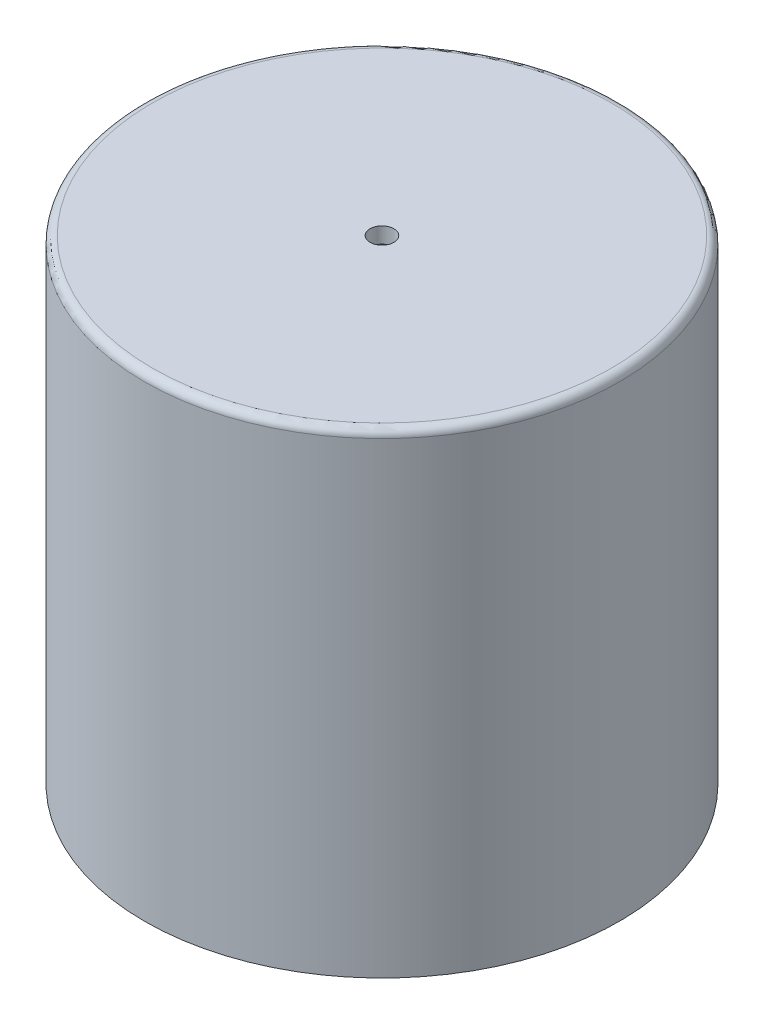
ISO-10303-21;
HEADER;
FILE_DESCRIPTION(('STEP AP214'),'2;1');
FILE_NAME('part.step','',(''),(''),'','','');
FILE_SCHEMA(('AUTOMOTIVE_DESIGN { 1 0 10303 214 1 1 1 1 }'));
ENDSEC;
DATA;
#1=APPLICATION_CONTEXT('core data for automotive mechanical design processes');
#2=APPLICATION_PROTOCOL_DEFINITION('international standard','automotive_design',2000,#1);
#3=PRODUCT_CONTEXT('',#1,'mechanical');
#4=PRODUCT('Part','Part','',(#3));
#5=PRODUCT_RELATED_PRODUCT_CATEGORY('part','',(#4));
#6=PRODUCT_DEFINITION_FORMATION('','',#4);
#7=PRODUCT_DEFINITION_CONTEXT('part definition',#1,'design');
#8=PRODUCT_DEFINITION('design','',#6,#7);
#9=PRODUCT_DEFINITION_SHAPE('','',#8);
#10=(LENGTH_UNIT() NAMED_UNIT(*) SI_UNIT(.MILLI.,.METRE.));
#11=(NAMED_UNIT(*) PLANE_ANGLE_UNIT() SI_UNIT($,.RADIAN.));
#12=(NAMED_UNIT(*) SI_UNIT($,.STERADIAN.) SOLID_ANGLE_UNIT());
#13=UNCERTAINTY_MEASURE_WITH_UNIT(LENGTH_MEASURE(1.E-05),#10,'distance_accuracy_value','');
#14=(GEOMETRIC_REPRESENTATION_CONTEXT(3) GLOBAL_UNCERTAINTY_ASSIGNED_CONTEXT((#13)) GLOBAL_UNIT_ASSIGNED_CONTEXT((#10,
#11,#12)) REPRESENTATION_CONTEXT('',''));
#15=CARTESIAN_POINT('',(0.,0.,0.));
#16=DIRECTION('',(0.,0.,1.));
#17=DIRECTION('',(1.,0.,0.));
#18=AXIS2_PLACEMENT_3D('',#15,#16,#17);
#19=CARTESIAN_POINT('',(0.,60.,0.));
#20=DIRECTION('',(0.,-1.,0.));
#21=DIRECTION('',(0.,0.,-1.));
#22=AXIS2_PLACEMENT_3D('',#19,#20,#21);
#23=CYLINDRICAL_SURFACE('',#22,30.);
#24=CARTESIAN_POINT('',(0.,59.,0.));
#25=DIRECTION('',(0.,1.,0.));
#26=DIRECTION('',(0.,0.,1.));
#27=AXIS2_PLACEMENT_3D('',#24,#25,#26);
#28=CIRCLE('',#27,30.);
#29=CARTESIAN_POINT('',(0.,59.,30.));
#30=VERTEX_POINT('',#29);
#31=EDGE_CURVE('E10',#30,#30,#28,.F.);
#32=ORIENTED_EDGE('',*,*,#31,.T.);
#33=EDGE_LOOP('',(#32));
#34=FACE_BOUND('',#33,.T.);
#35=CARTESIAN_POINT('',(0.,0.,0.));
#36=DIRECTION('',(0.,1.,0.));
#37=DIRECTION('',(0.,0.,1.));
#38=AXIS2_PLACEMENT_3D('',#35,#36,#37);
#39=CIRCLE('',#38,30.);
#40=CARTESIAN_POINT('',(0.,0.,30.));
#41=VERTEX_POINT('',#40);
#42=EDGE_CURVE('E53',#41,#41,#39,.T.);
#43=ORIENTED_EDGE('',*,*,#42,.T.);
#44=EDGE_LOOP('',(#43));
#45=FACE_BOUND('',#44,.T.);
#46=ADVANCED_FACE('F33',(#34,#45),#23,.T.);
#47=CARTESIAN_POINT('',(0.,60.,0.));
#48=DIRECTION('',(0.,1.,0.));
#49=DIRECTION('',(0.,0.,1.));
#50=AXIS2_PLACEMENT_3D('',#47,#48,#49);
#51=PLANE('',#50);
#52=CARTESIAN_POINT('',(0.,60.,0.));
#53=DIRECTION('',(0.,1.,0.));
#54=DIRECTION('',(0.,0.,1.));
#55=AXIS2_PLACEMENT_3D('',#52,#53,#54);
#56=CIRCLE('',#55,29.);
#57=CARTESIAN_POINT('',(0.,60.,29.));
#58=VERTEX_POINT('',#57);
#59=EDGE_CURVE('E40',#58,#58,#56,.T.);
#60=ORIENTED_EDGE('',*,*,#59,.T.);
#61=EDGE_LOOP('',(#60));
#62=FACE_BOUND('',#61,.T.);
#63=CARTESIAN_POINT('',(0.,60.,0.));
#64=DIRECTION('',(0.,1.,0.));
#65=DIRECTION('',(0.,0.,1.));
#66=AXIS2_PLACEMENT_3D('',#63,#64,#65);
#67=CIRCLE('',#66,1.5);
#68=CARTESIAN_POINT('',(0.,60.,1.5));
#69=VERTEX_POINT('',#68);
#70=EDGE_CURVE('E62',#69,#69,#67,.T.);
#71=ORIENTED_EDGE('',*,*,#70,.F.);
#72=EDGE_LOOP('',(#71));
#73=FACE_BOUND('',#72,.T.);
#74=ADVANCED_FACE('F69',(#62,#73),#51,.T.);
#75=CARTESIAN_POINT('',(0.,0.,0.));
#76=DIRECTION('',(0.,1.,0.));
#77=DIRECTION('',(0.,0.,1.));
#78=AXIS2_PLACEMENT_3D('',#75,#76,#77);
#79=PLANE('',#78);
#80=CARTESIAN_POINT('',(0.,0.,0.));
#81=DIRECTION('',(0.,-1.,0.));
#82=DIRECTION('',(0.,0.,-1.));
#83=AXIS2_PLACEMENT_3D('',#80,#81,#82);
#84=CIRCLE('',#83,28.4);
#85=CARTESIAN_POINT('',(0.,0.,-28.4));
#86=VERTEX_POINT('',#85);
#87=EDGE_CURVE('E56',#86,#86,#84,.T.);
#88=ORIENTED_EDGE('',*,*,#87,.F.);
#89=EDGE_LOOP('',(#88));
#90=FACE_BOUND('',#89,.T.);
#91=ORIENTED_EDGE('',*,*,#42,.F.);
#92=EDGE_LOOP('',(#91));
#93=FACE_BOUND('',#92,.T.);
#94=ADVANCED_FACE('F71',(#90,#93),#79,.F.);
#95=CARTESIAN_POINT('',(0.,58.,0.));
#96=DIRECTION('',(0.,-1.,0.));
#97=DIRECTION('',(0.,0.,-1.));
#98=AXIS2_PLACEMENT_3D('',#95,#96,#97);
#99=CYLINDRICAL_SURFACE('',#98,28.4);
#100=CARTESIAN_POINT('',(0.,57.,0.));
#101=DIRECTION('',(0.,-1.,0.));
#102=DIRECTION('',(0.,0.,-1.));
#103=AXIS2_PLACEMENT_3D('',#100,#101,#102);
#104=CIRCLE('',#103,28.4);
#105=CARTESIAN_POINT('',(0.,57.,-28.4));
#106=VERTEX_POINT('',#105);
#107=EDGE_CURVE('E44',#106,#106,#104,.F.);
#108=CARTESIAN_POINT('',(0.,57.,-28.4));
#109=CARTESIAN_POINT('',(0.,56.40625,-28.4));
#110=CARTESIAN_POINT('',(0.,55.8125,-28.4));
#111=CARTESIAN_POINT('',(0.,54.625,-28.4));
#112=CARTESIAN_POINT('',(0.,54.03125,-28.4));
#113=CARTESIAN_POINT('',(0.,52.84375,-28.4));
#114=CARTESIAN_POINT('',(0.,52.25,-28.4));
#115=CARTESIAN_POINT('',(0.,51.0625,-28.4));
#116=CARTESIAN_POINT('',(0.,50.46875,-28.4));
#117=CARTESIAN_POINT('',(0.,49.28125,-28.4));
#118=CARTESIAN_POINT('',(0.,48.6875,-28.4));
#119=CARTESIAN_POINT('',(0.,47.5,-28.4));
#120=CARTESIAN_POINT('',(0.,46.90625,-28.4));
#121=CARTESIAN_POINT('',(0.,45.71875,-28.4));
#122=CARTESIAN_POINT('',(0.,45.125,-28.4));
#123=CARTESIAN_POINT('',(0.,43.9375,-28.4));
#124=CARTESIAN_POINT('',(0.,43.34375,-28.4));
#125=CARTESIAN_POINT('',(0.,42.15625,-28.4));
#126=CARTESIAN_POINT('',(0.,41.5625,-28.4));
#127=CARTESIAN_POINT('',(0.,40.375,-28.4));
#128=CARTESIAN_POINT('',(0.,39.78125,-28.4));
#129=CARTESIAN_POINT('',(0.,38.59375,-28.4));
#130=CARTESIAN_POINT('',(0.,38.,-28.4));
#131=CARTESIAN_POINT('',(0.,36.8125,-28.4));
#132=CARTESIAN_POINT('',(0.,36.21875,-28.4));
#133=CARTESIAN_POINT('',(0.,35.03125,-28.4));
#134=CARTESIAN_POINT('',(0.,34.4375,-28.4));
#135=CARTESIAN_POINT('',(0.,33.25,-28.4));
#136=CARTESIAN_POINT('',(0.,32.65625,-28.4));
#137=CARTESIAN_POINT('',(0.,31.46875,-28.4));
#138=CARTESIAN_POINT('',(0.,30.875,-28.4));
#139=CARTESIAN_POINT('',(0.,29.6875,-28.4));
#140=CARTESIAN_POINT('',(0.,29.09375,-28.4));
#141=CARTESIAN_POINT('',(0.,27.90625,-28.4));
#142=CARTESIAN_POINT('',(0.,27.3125,-28.4));
#143=CARTESIAN_POINT('',(0.,26.125,-28.4));
#144=CARTESIAN_POINT('',(0.,25.53125,-28.4));
#145=CARTESIAN_POINT('',(0.,24.34375,-28.4));
#146=CARTESIAN_POINT('',(0.,23.75,-28.4));
#147=CARTESIAN_POINT('',(0.,22.5625,-28.4));
#148=CARTESIAN_POINT('',(0.,21.96875,-28.4));
#149=CARTESIAN_POINT('',(0.,20.78125,-28.4));
#150=CARTESIAN_POINT('',(0.,20.1875,-28.4));
#151=CARTESIAN_POINT('',(0.,19.,-28.4));
#152=CARTESIAN_POINT('',(0.,18.40625,-28.4));
#153=CARTESIAN_POINT('',(0.,17.21875,-28.4));
#154=CARTESIAN_POINT('',(0.,16.625,-28.4));
#155=CARTESIAN_POINT('',(0.,15.4375,-28.4));
#156=CARTESIAN_POINT('',(0.,14.84375,-28.4));
#157=CARTESIAN_POINT('',(0.,13.65625,-28.4));
#158=CARTESIAN_POINT('',(0.,13.0625,-28.4));
#159=CARTESIAN_POINT('',(0.,11.875,-28.4));
#160=CARTESIAN_POINT('',(0.,11.28125,-28.4));
#161=CARTESIAN_POINT('',(0.,10.09375,-28.4));
#162=CARTESIAN_POINT('',(0.,9.5,-28.4));
#163=CARTESIAN_POINT('',(0.,8.3125,-28.4));
#164=CARTESIAN_POINT('',(0.,7.71875,-28.4));
#165=CARTESIAN_POINT('',(0.,6.53125,-28.4));
#166=CARTESIAN_POINT('',(0.,5.9375,-28.4));
#167=CARTESIAN_POINT('',(0.,4.75,-28.4));
#168=CARTESIAN_POINT('',(0.,4.15625,-28.4));
#169=CARTESIAN_POINT('',(0.,2.96875,-28.4));
#170=CARTESIAN_POINT('',(0.,2.375,-28.4));
#171=CARTESIAN_POINT('',(0.,1.1875,-28.4));
#172=CARTESIAN_POINT('',(0.,0.593749999999999,-28.4));
#173=CARTESIAN_POINT('',(0.,0.,-28.4));
#174=B_SPLINE_CURVE_WITH_KNOTS('',3,(#108,#109,#110,#111,#112,#113,#114,#115,#116,#117,#118,
#119,#120,#121,#122,#123,#124,#125,#126,#127,#128,#129,#130,#131,#132,#133,#134,#135,#136,#137,
#138,#139,#140,#141,#142,#143,#144,#145,#146,#147,#148,#149,#150,#151,#152,#153,#154,#155,#156,
#157,#158,#159,#160,#161,#162,#163,#164,#165,#166,#167,#168,#169,#170,#171,#172,#173),
.UNSPECIFIED.,.F.,.F.,(4,2,2,2,2,2,2,2,2,2,2,2,2,2,2,2,2,2,2,2,2,2,2,2,2,2,2,2,2,2,2,2,4),(0.,
1.78125,3.5625,5.34374999999999,7.125,8.90625,10.6875,12.46875,14.25,16.03125,17.8125,19.59375,
21.375,23.15625,24.9375,26.71875,28.5,30.28125,32.0625,33.84375,35.625,37.40625,39.1875,
40.96875,42.75,44.53125,46.3125,48.09375,49.875,51.65625,53.4375,55.21875,57.),.UNSPECIFIED.);
#175=EDGE_CURVE('BSEAM77',#106,#86,#174,.T.);
#176=ORIENTED_EDGE('',*,*,#107,.T.);
#177=ORIENTED_EDGE('',*,*,#87,.T.);
#178=ORIENTED_EDGE('',*,*,#175,.T.);
#179=ORIENTED_EDGE('',*,*,#175,.F.);
#180=EDGE_LOOP('',(#176,#178,#177,#179));
#181=FACE_BOUND('',#180,.T.);
#182=ADVANCED_FACE('F77',(#181),#99,.F.);
#183=CARTESIAN_POINT('',(0.,58.,0.));
#184=DIRECTION('',(0.,-1.,0.));
#185=DIRECTION('',(0.,0.,-1.));
#186=AXIS2_PLACEMENT_3D('',#183,#184,#185);
#187=PLANE('',#186);
#188=CARTESIAN_POINT('',(0.,58.,0.));
#189=DIRECTION('',(0.,-1.,0.));
#190=DIRECTION('',(0.,0.,-1.));
#191=AXIS2_PLACEMENT_3D('',#188,#189,#190);
#192=CIRCLE('',#191,27.4);
#193=CARTESIAN_POINT('',(0.,58.,-27.4));
#194=VERTEX_POINT('',#193);
#195=EDGE_CURVE('E48',#194,#194,#192,.T.);
#196=ORIENTED_EDGE('',*,*,#195,.T.);
#197=EDGE_LOOP('',(#196));
#198=FACE_BOUND('',#197,.T.);
#199=CARTESIAN_POINT('',(0.,58.,0.));
#200=DIRECTION('',(0.,-1.,0.));
#201=DIRECTION('',(0.,0.,-1.));
#202=AXIS2_PLACEMENT_3D('',#199,#200,#201);
#203=CIRCLE('',#202,1.5);
#204=CARTESIAN_POINT('',(0.,58.,1.5));
#205=VERTEX_POINT('',#204);
#206=EDGE_CURVE('E59',#205,#205,#203,.F.);
#207=ORIENTED_EDGE('',*,*,#206,.T.);
#208=EDGE_LOOP('',(#207));
#209=FACE_BOUND('',#208,.T.);
#210=ADVANCED_FACE('F91',(#198,#209),#187,.T.);
#211=CARTESIAN_POINT('',(0.,53.7573593128807,0.));
#212=DIRECTION('',(0.,1.,0.));
#213=DIRECTION('',(0.,0.,1.));
#214=AXIS2_PLACEMENT_3D('',#211,#212,#213);
#215=CYLINDRICAL_SURFACE('',#214,1.5);
#216=CARTESIAN_POINT('',(0.,60.,1.5));
#217=CARTESIAN_POINT('',(0.,59.9791666666667,1.5));
#218=CARTESIAN_POINT('',(0.,59.9583333333333,1.5));
#219=CARTESIAN_POINT('',(0.,59.9166666666667,1.5));
#220=CARTESIAN_POINT('',(0.,59.8958333333333,1.5));
#221=CARTESIAN_POINT('',(0.,59.8541666666667,1.5));
#222=CARTESIAN_POINT('',(0.,59.8333333333333,1.5));
#223=CARTESIAN_POINT('',(0.,59.7916666666667,1.5));
#224=CARTESIAN_POINT('',(0.,59.7708333333333,1.5));
#225=CARTESIAN_POINT('',(0.,59.7291666666667,1.5));
#226=CARTESIAN_POINT('',(0.,59.7083333333333,1.5));
#227=CARTESIAN_POINT('',(0.,59.6666666666667,1.5));
#228=CARTESIAN_POINT('',(0.,59.6458333333333,1.5));
#229=CARTESIAN_POINT('',(0.,59.6041666666667,1.5));
#230=CARTESIAN_POINT('',(0.,59.5833333333333,1.5));
#231=CARTESIAN_POINT('',(0.,59.5416666666667,1.5));
#232=CARTESIAN_POINT('',(0.,59.5208333333333,1.5));
#233=CARTESIAN_POINT('',(0.,59.4791666666667,1.5));
#234=CARTESIAN_POINT('',(0.,59.4583333333333,1.5));
#235=CARTESIAN_POINT('',(0.,59.4166666666667,1.5));
#236=CARTESIAN_POINT('',(0.,59.3958333333333,1.5));
#237=CARTESIAN_POINT('',(0.,59.3541666666667,1.5));
#238=CARTESIAN_POINT('',(0.,59.3333333333333,1.5));
#239=CARTESIAN_POINT('',(0.,59.2916666666667,1.5));
#240=CARTESIAN_POINT('',(0.,59.2708333333333,1.5));
#241=CARTESIAN_POINT('',(0.,59.2291666666667,1.5));
#242=CARTESIAN_POINT('',(0.,59.2083333333333,1.5));
#243=CARTESIAN_POINT('',(0.,59.1666666666667,1.5));
#244=CARTESIAN_POINT('',(0.,59.1458333333333,1.5));
#245=CARTESIAN_POINT('',(0.,59.1041666666667,1.5));
#246=CARTESIAN_POINT('',(0.,59.0833333333333,1.5));
#247=CARTESIAN_POINT('',(0.,59.0416666666667,1.5));
#248=CARTESIAN_POINT('',(0.,59.0208333333333,1.5));
#249=CARTESIAN_POINT('',(0.,58.9791666666667,1.5));
#250=CARTESIAN_POINT('',(0.,58.9583333333333,1.5));
#251=CARTESIAN_POINT('',(0.,58.9166666666667,1.5));
#252=CARTESIAN_POINT('',(0.,58.8958333333333,1.5));
#253=CARTESIAN_POINT('',(0.,58.8541666666667,1.5));
#254=CARTESIAN_POINT('',(0.,58.8333333333333,1.5));
#255=CARTESIAN_POINT('',(0.,58.7916666666667,1.5));
#256=CARTESIAN_POINT('',(0.,58.7708333333333,1.5));
#257=CARTESIAN_POINT('',(0.,58.7291666666667,1.5));
#258=CARTESIAN_POINT('',(0.,58.7083333333333,1.5));
#259=CARTESIAN_POINT('',(0.,58.6666666666667,1.5));
#260=CARTESIAN_POINT('',(0.,58.6458333333333,1.5));
#261=CARTESIAN_POINT('',(0.,58.6041666666667,1.5));
#262=CARTESIAN_POINT('',(0.,58.5833333333333,1.5));
#263=CARTESIAN_POINT('',(0.,58.5416666666667,1.5));
#264=CARTESIAN_POINT('',(0.,58.5208333333333,1.5));
#265=CARTESIAN_POINT('',(0.,58.4791666666667,1.5));
#266=CARTESIAN_POINT('',(0.,58.4583333333333,1.5));
#267=CARTESIAN_POINT('',(0.,58.4166666666667,1.5));
#268=CARTESIAN_POINT('',(0.,58.3958333333333,1.5));
#269=CARTESIAN_POINT('',(0.,58.3541666666667,1.5));
#270=CARTESIAN_POINT('',(0.,58.3333333333333,1.5));
#271=CARTESIAN_POINT('',(0.,58.2916666666667,1.5));
#272=CARTESIAN_POINT('',(0.,58.2708333333333,1.5));
#273=CARTESIAN_POINT('',(0.,58.2291666666667,1.5));
#274=CARTESIAN_POINT('',(0.,58.2083333333333,1.5));
#275=CARTESIAN_POINT('',(0.,58.1666666666667,1.5));
#276=CARTESIAN_POINT('',(0.,58.1458333333333,1.5));
#277=CARTESIAN_POINT('',(0.,58.1041666666667,1.5));
#278=CARTESIAN_POINT('',(0.,58.0833333333333,1.5));
#279=CARTESIAN_POINT('',(0.,58.0416666666667,1.5));
#280=CARTESIAN_POINT('',(0.,58.0208333333333,1.5));
#281=CARTESIAN_POINT('',(0.,58.,1.5));
#282=B_SPLINE_CURVE_WITH_KNOTS('',3,(#216,#217,#218,#219,#220,#221,#222,#223,#224,#225,#226,
#227,#228,#229,#230,#231,#232,#233,#234,#235,#236,#237,#238,#239,#240,#241,#242,#243,#244,#245,
#246,#247,#248,#249,#250,#251,#252,#253,#254,#255,#256,#257,#258,#259,#260,#261,#262,#263,#264,
#265,#266,#267,#268,#269,#270,#271,#272,#273,#274,#275,#276,#277,#278,#279,#280,#281),
.UNSPECIFIED.,.F.,.F.,(4,2,2,2,2,2,2,2,2,2,2,2,2,2,2,2,2,2,2,2,2,2,2,2,2,2,2,2,2,2,2,2,4),(0.,
0.0625000000000001,0.124999999999993,0.187499999999993,0.249999999999993,0.312499999999993,
0.374999999999993,0.437499999999993,0.499999999999994,0.562499999999994,0.624999999999994,
0.687499999999994,0.749999999999994,0.812499999999994,0.874999999999994,0.937499999999994,
0.999999999999994,1.06249999999999,1.12499999999999,1.18749999999999,1.24999999999999,
1.31249999999999,1.37499999999999,1.43749999999999,1.49999999999999,1.56249999999999,
1.62499999999999,1.68749999999999,1.74999999999999,1.81249999999999,1.87499999999999,
1.93749999999999,1.99999999999999),.UNSPECIFIED.);
#283=EDGE_CURVE('BSEAM66',#69,#205,#282,.T.);
#284=ORIENTED_EDGE('',*,*,#70,.T.);
#285=ORIENTED_EDGE('',*,*,#206,.F.);
#286=ORIENTED_EDGE('',*,*,#283,.T.);
#287=ORIENTED_EDGE('',*,*,#283,.F.);
#288=EDGE_LOOP('',(#284,#286,#285,#287));
#289=FACE_BOUND('',#288,.T.);
#290=ADVANCED_FACE('F66',(#289),#215,.F.);
#291=CARTESIAN_POINT('',(0.,57.,0.));
#292=DIRECTION('',(0.,-1.,0.));
#293=DIRECTION('',(0.,0.,-1.));
#294=AXIS2_PLACEMENT_3D('',#291,#292,#293);
#295=TOROIDAL_SURFACE('',#294,27.4,1.);
#296=ORIENTED_EDGE('',*,*,#107,.F.);
#297=EDGE_LOOP('',(#296));
#298=FACE_BOUND('',#297,.T.);
#299=ORIENTED_EDGE('',*,*,#195,.F.);
#300=EDGE_LOOP('',(#299));
#301=FACE_BOUND('',#300,.T.);
#302=ADVANCED_FACE('F83',(#298,#301),#295,.F.);
#303=CARTESIAN_POINT('',(0.,59.,0.));
#304=DIRECTION('',(0.,1.,0.));
#305=DIRECTION('',(0.,0.,1.));
#306=AXIS2_PLACEMENT_3D('',#303,#304,#305);
#307=TOROIDAL_SURFACE('',#306,29.,1.);
#308=ORIENTED_EDGE('',*,*,#31,.F.);
#309=EDGE_LOOP('',(#308));
#310=FACE_BOUND('',#309,.T.);
#311=ORIENTED_EDGE('',*,*,#59,.F.);
#312=EDGE_LOOP('',(#311));
#313=FACE_BOUND('',#312,.T.);
#314=ADVANCED_FACE('F35',(#310,#313),#307,.T.);
#315=CLOSED_SHELL('',(#46,#74,#94,#182,#210,#290,#302,#314));
#316=MANIFOLD_SOLID_BREP('B2',#315);
#317=ADVANCED_BREP_SHAPE_REPRESENTATION('',(#18,#316),#14);
#318=SHAPE_DEFINITION_REPRESENTATION(#9,#317);
ENDSEC;
END-ISO-10303-21;
